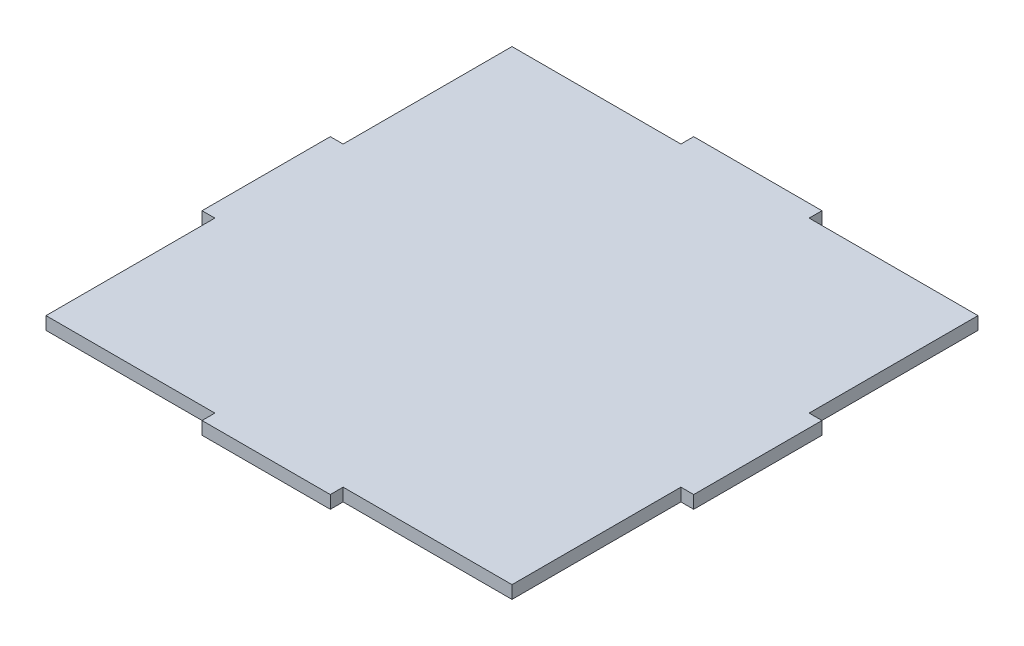
ISO-10303-21;
HEADER;
FILE_DESCRIPTION(('STEP AP214'),'2;1');
FILE_NAME('part.step','',(''),(''),'','','');
FILE_SCHEMA(('AUTOMOTIVE_DESIGN { 1 0 10303 214 1 1 1 1 }'));
ENDSEC;
DATA;
#1=APPLICATION_CONTEXT('core data for automotive mechanical design processes');
#2=APPLICATION_PROTOCOL_DEFINITION('international standard','automotive_design',2000,#1);
#3=PRODUCT_CONTEXT('',#1,'mechanical');
#4=PRODUCT('Part','Part','',(#3));
#5=PRODUCT_RELATED_PRODUCT_CATEGORY('part','',(#4));
#6=PRODUCT_DEFINITION_FORMATION('','',#4);
#7=PRODUCT_DEFINITION_CONTEXT('part definition',#1,'design');
#8=PRODUCT_DEFINITION('design','',#6,#7);
#9=PRODUCT_DEFINITION_SHAPE('','',#8);
#10=(LENGTH_UNIT() NAMED_UNIT(*) SI_UNIT(.MILLI.,.METRE.));
#11=(NAMED_UNIT(*) PLANE_ANGLE_UNIT() SI_UNIT($,.RADIAN.));
#12=(NAMED_UNIT(*) SI_UNIT($,.STERADIAN.) SOLID_ANGLE_UNIT());
#13=UNCERTAINTY_MEASURE_WITH_UNIT(LENGTH_MEASURE(1.E-05),#10,'distance_accuracy_value','');
#14=(GEOMETRIC_REPRESENTATION_CONTEXT(3) GLOBAL_UNCERTAINTY_ASSIGNED_CONTEXT((#13)) GLOBAL_UNIT_ASSIGNED_CONTEXT((#10,
#11,#12)) REPRESENTATION_CONTEXT('',''));
#15=CARTESIAN_POINT('',(0.,0.,0.));
#16=DIRECTION('',(0.,0.,1.));
#17=DIRECTION('',(1.,0.,0.));
#18=AXIS2_PLACEMENT_3D('',#15,#16,#17);
#19=CARTESIAN_POINT('',(14.9999999999994,3.,-1.73472347597673E-13));
#20=DIRECTION('',(1.,0.,0.));
#21=DIRECTION('',(0.,0.,-1.));
#22=AXIS2_PLACEMENT_3D('',#19,#20,#21);
#23=PLANE('',#22);
#24=DIRECTION('',(0.,0.,1.));
#25=VECTOR('',#24,1.);
#26=CARTESIAN_POINT('',(14.9999999999994,0.,-1.73472347597673E-13));
#27=LINE('',#26,#25);
#28=CARTESIAN_POINT('',(15.,0.,54.5));
#29=VERTEX_POINT('',#28);
#30=CARTESIAN_POINT('',(15.,0.,57.5));
#31=VERTEX_POINT('',#30);
#32=EDGE_CURVE('E207',#29,#31,#27,.T.);
#33=ORIENTED_EDGE('',*,*,#32,.F.);
#34=DIRECTION('',(0.,-1.,0.));
#35=VECTOR('',#34,1.);
#36=CARTESIAN_POINT('',(15.,3.,54.5));
#37=LINE('',#36,#35);
#38=CARTESIAN_POINT('',(15.,3.,54.5));
#39=VERTEX_POINT('',#38);
#40=EDGE_CURVE('E11',#39,#29,#37,.T.);
#41=ORIENTED_EDGE('',*,*,#40,.F.);
#42=DIRECTION('',(0.,0.,1.));
#43=VECTOR('',#42,1.);
#44=CARTESIAN_POINT('',(14.9999999999994,3.,-1.73472347597673E-13));
#45=LINE('',#44,#43);
#46=CARTESIAN_POINT('',(15.,3.,57.5));
#47=VERTEX_POINT('',#46);
#48=EDGE_CURVE('E254',#39,#47,#45,.T.);
#49=ORIENTED_EDGE('',*,*,#48,.T.);
#50=DIRECTION('',(0.,-1.,0.));
#51=VECTOR('',#50,1.);
#52=CARTESIAN_POINT('',(15.,3.,57.5));
#53=LINE('',#52,#51);
#54=EDGE_CURVE('E55',#47,#31,#53,.T.);
#55=ORIENTED_EDGE('',*,*,#54,.T.);
#56=EDGE_LOOP('',(#33,#41,#49,#55));
#57=FACE_BOUND('',#56,.T.);
#58=ADVANCED_FACE('F39',(#57),#23,.T.);
#59=CARTESIAN_POINT('',(0.,3.,54.5));
#60=DIRECTION('',(0.,0.,1.));
#61=DIRECTION('',(1.,0.,0.));
#62=AXIS2_PLACEMENT_3D('',#59,#60,#61);
#63=PLANE('',#62);
#64=DIRECTION('',(-1.,0.,0.));
#65=VECTOR('',#64,1.);
#66=CARTESIAN_POINT('',(0.,0.,54.5));
#67=LINE('',#66,#65);
#68=CARTESIAN_POINT('',(54.5,0.,54.5));
#69=VERTEX_POINT('',#68);
#70=EDGE_CURVE('E209',#69,#29,#67,.T.);
#71=ORIENTED_EDGE('',*,*,#70,.F.);
#72=DIRECTION('',(0.,-1.,0.));
#73=VECTOR('',#72,1.);
#74=CARTESIAN_POINT('',(54.5,3.,54.5));
#75=LINE('',#74,#73);
#76=CARTESIAN_POINT('',(54.5,3.,54.5));
#77=VERTEX_POINT('',#76);
#78=EDGE_CURVE('E47',#77,#69,#75,.T.);
#79=ORIENTED_EDGE('',*,*,#78,.F.);
#80=DIRECTION('',(-1.,0.,0.));
#81=VECTOR('',#80,1.);
#82=CARTESIAN_POINT('',(0.,3.,54.5));
#83=LINE('',#82,#81);
#84=EDGE_CURVE('E198',#77,#39,#83,.T.);
#85=ORIENTED_EDGE('',*,*,#84,.T.);
#86=ORIENTED_EDGE('',*,*,#40,.T.);
#87=EDGE_LOOP('',(#71,#79,#85,#86));
#88=FACE_BOUND('',#87,.T.);
#89=ADVANCED_FACE('F297',(#88),#63,.T.);
#90=CARTESIAN_POINT('',(54.5,3.,0.));
#91=DIRECTION('',(1.,0.,0.));
#92=DIRECTION('',(0.,0.,-1.));
#93=AXIS2_PLACEMENT_3D('',#90,#91,#92);
#94=PLANE('',#93);
#95=DIRECTION('',(0.,0.,1.));
#96=VECTOR('',#95,1.);
#97=CARTESIAN_POINT('',(54.5,0.,0.));
#98=LINE('',#97,#96);
#99=CARTESIAN_POINT('',(54.5,0.,15.));
#100=VERTEX_POINT('',#99);
#101=EDGE_CURVE('E212',#100,#69,#98,.T.);
#102=ORIENTED_EDGE('',*,*,#101,.F.);
#103=DIRECTION('',(0.,-1.,0.));
#104=VECTOR('',#103,1.);
#105=CARTESIAN_POINT('',(54.5,3.,15.));
#106=LINE('',#105,#104);
#107=CARTESIAN_POINT('',(54.5,3.,15.));
#108=VERTEX_POINT('',#107);
#109=EDGE_CURVE('E286',#108,#100,#106,.T.);
#110=ORIENTED_EDGE('',*,*,#109,.F.);
#111=DIRECTION('',(0.,0.,1.));
#112=VECTOR('',#111,1.);
#113=CARTESIAN_POINT('',(54.5,3.,0.));
#114=LINE('',#113,#112);
#115=EDGE_CURVE('E293',#108,#77,#114,.T.);
#116=ORIENTED_EDGE('',*,*,#115,.T.);
#117=ORIENTED_EDGE('',*,*,#78,.T.);
#118=EDGE_LOOP('',(#102,#110,#116,#117));
#119=FACE_BOUND('',#118,.T.);
#120=ADVANCED_FACE('F291',(#119),#94,.T.);
#121=CARTESIAN_POINT('',(0.,3.,15.));
#122=DIRECTION('',(0.,0.,-1.));
#123=DIRECTION('',(-1.,0.,0.));
#124=AXIS2_PLACEMENT_3D('',#121,#122,#123);
#125=PLANE('',#124);
#126=DIRECTION('',(1.,0.,0.));
#127=VECTOR('',#126,1.);
#128=CARTESIAN_POINT('',(0.,0.,15.));
#129=LINE('',#128,#127);
#130=CARTESIAN_POINT('',(57.5,0.,15.));
#131=VERTEX_POINT('',#130);
#132=EDGE_CURVE('E215',#100,#131,#129,.T.);
#133=ORIENTED_EDGE('',*,*,#132,.T.);
#134=DIRECTION('',(0.,-1.,0.));
#135=VECTOR('',#134,1.);
#136=CARTESIAN_POINT('',(57.5,3.,15.));
#137=LINE('',#136,#135);
#138=CARTESIAN_POINT('',(57.5,3.,15.));
#139=VERTEX_POINT('',#138);
#140=EDGE_CURVE('E284',#139,#131,#137,.T.);
#141=ORIENTED_EDGE('',*,*,#140,.F.);
#142=DIRECTION('',(1.,0.,0.));
#143=VECTOR('',#142,1.);
#144=CARTESIAN_POINT('',(0.,3.,15.));
#145=LINE('',#144,#143);
#146=EDGE_CURVE('E308',#108,#139,#145,.T.);
#147=ORIENTED_EDGE('',*,*,#146,.F.);
#148=ORIENTED_EDGE('',*,*,#109,.T.);
#149=EDGE_LOOP('',(#133,#141,#147,#148));
#150=FACE_BOUND('',#149,.T.);
#151=ADVANCED_FACE('F305',(#150),#125,.F.);
#152=CARTESIAN_POINT('',(57.5,3.,0.));
#153=DIRECTION('',(1.,0.,0.));
#154=DIRECTION('',(0.,0.,-1.));
#155=AXIS2_PLACEMENT_3D('',#152,#153,#154);
#156=PLANE('',#155);
#157=DIRECTION('',(0.,0.,1.));
#158=VECTOR('',#157,1.);
#159=CARTESIAN_POINT('',(57.5,0.,0.));
#160=LINE('',#159,#158);
#161=CARTESIAN_POINT('',(57.5,0.,-15.));
#162=VERTEX_POINT('',#161);
#163=EDGE_CURVE('E219',#162,#131,#160,.T.);
#164=ORIENTED_EDGE('',*,*,#163,.F.);
#165=DIRECTION('',(0.,-1.,0.));
#166=VECTOR('',#165,1.);
#167=CARTESIAN_POINT('',(57.5,3.,-15.));
#168=LINE('',#167,#166);
#169=CARTESIAN_POINT('',(57.5,3.,-15.));
#170=VERTEX_POINT('',#169);
#171=EDGE_CURVE('E282',#170,#162,#168,.T.);
#172=ORIENTED_EDGE('',*,*,#171,.F.);
#173=DIRECTION('',(0.,0.,1.));
#174=VECTOR('',#173,1.);
#175=CARTESIAN_POINT('',(57.5,3.,0.));
#176=LINE('',#175,#174);
#177=EDGE_CURVE('E310',#170,#139,#176,.T.);
#178=ORIENTED_EDGE('',*,*,#177,.T.);
#179=ORIENTED_EDGE('',*,*,#140,.T.);
#180=EDGE_LOOP('',(#164,#172,#178,#179));
#181=FACE_BOUND('',#180,.T.);
#182=ADVANCED_FACE('F424',(#181),#156,.T.);
#183=CARTESIAN_POINT('',(0.,3.,-15.));
#184=DIRECTION('',(0.,0.,1.));
#185=DIRECTION('',(1.,0.,0.));
#186=AXIS2_PLACEMENT_3D('',#183,#184,#185);
#187=PLANE('',#186);
#188=DIRECTION('',(-1.,0.,0.));
#189=VECTOR('',#188,1.);
#190=CARTESIAN_POINT('',(0.,0.,-15.));
#191=LINE('',#190,#189);
#192=CARTESIAN_POINT('',(54.5,0.,-15.));
#193=VERTEX_POINT('',#192);
#194=EDGE_CURVE('E222',#162,#193,#191,.T.);
#195=ORIENTED_EDGE('',*,*,#194,.T.);
#196=DIRECTION('',(0.,-1.,0.));
#197=VECTOR('',#196,1.);
#198=CARTESIAN_POINT('',(54.5,3.,-15.));
#199=LINE('',#198,#197);
#200=CARTESIAN_POINT('',(54.5,3.,-15.));
#201=VERTEX_POINT('',#200);
#202=EDGE_CURVE('E280',#201,#193,#199,.T.);
#203=ORIENTED_EDGE('',*,*,#202,.F.);
#204=DIRECTION('',(-1.,0.,0.));
#205=VECTOR('',#204,1.);
#206=CARTESIAN_POINT('',(0.,3.,-15.));
#207=LINE('',#206,#205);
#208=EDGE_CURVE('E316',#170,#201,#207,.T.);
#209=ORIENTED_EDGE('',*,*,#208,.F.);
#210=ORIENTED_EDGE('',*,*,#171,.T.);
#211=EDGE_LOOP('',(#195,#203,#209,#210));
#212=FACE_BOUND('',#211,.T.);
#213=ADVANCED_FACE('F425',(#212),#187,.F.);
#214=CARTESIAN_POINT('',(54.5,0.,-54.5));
#215=VERTEX_POINT('',#214);
#216=EDGE_CURVE('E216',#215,#193,#98,.T.);
#217=ORIENTED_EDGE('',*,*,#216,.F.);
#218=DIRECTION('',(0.,-1.,0.));
#219=VECTOR('',#218,1.);
#220=CARTESIAN_POINT('',(54.5,3.,-54.5));
#221=LINE('',#220,#219);
#222=CARTESIAN_POINT('',(54.5,3.,-54.5));
#223=VERTEX_POINT('',#222);
#224=EDGE_CURVE('E278',#223,#215,#221,.T.);
#225=ORIENTED_EDGE('',*,*,#224,.F.);
#226=EDGE_CURVE('E313',#223,#201,#114,.T.);
#227=ORIENTED_EDGE('',*,*,#226,.T.);
#228=ORIENTED_EDGE('',*,*,#202,.T.);
#229=EDGE_LOOP('',(#217,#225,#227,#228));
#230=FACE_BOUND('',#229,.T.);
#231=ADVANCED_FACE('F368',(#230),#94,.T.);
#232=CARTESIAN_POINT('',(0.,3.,-54.5));
#233=DIRECTION('',(0.,0.,-1.));
#234=DIRECTION('',(-1.,0.,0.));
#235=AXIS2_PLACEMENT_3D('',#232,#233,#234);
#236=PLANE('',#235);
#237=DIRECTION('',(1.,0.,0.));
#238=VECTOR('',#237,1.);
#239=CARTESIAN_POINT('',(0.,0.,-54.5));
#240=LINE('',#239,#238);
#241=CARTESIAN_POINT('',(15.,0.,-54.5));
#242=VERTEX_POINT('',#241);
#243=EDGE_CURVE('E225',#242,#215,#240,.T.);
#244=ORIENTED_EDGE('',*,*,#243,.F.);
#245=DIRECTION('',(0.,-1.,0.));
#246=VECTOR('',#245,1.);
#247=CARTESIAN_POINT('',(15.,3.,-54.5));
#248=LINE('',#247,#246);
#249=CARTESIAN_POINT('',(15.,3.,-54.5));
#250=VERTEX_POINT('',#249);
#251=EDGE_CURVE('E276',#250,#242,#248,.T.);
#252=ORIENTED_EDGE('',*,*,#251,.F.);
#253=DIRECTION('',(1.,0.,0.));
#254=VECTOR('',#253,1.);
#255=CARTESIAN_POINT('',(0.,3.,-54.5));
#256=LINE('',#255,#254);
#257=EDGE_CURVE('E315',#250,#223,#256,.T.);
#258=ORIENTED_EDGE('',*,*,#257,.T.);
#259=ORIENTED_EDGE('',*,*,#224,.T.);
#260=EDGE_LOOP('',(#244,#252,#258,#259));
#261=FACE_BOUND('',#260,.T.);
#262=ADVANCED_FACE('F394',(#261),#236,.T.);
#263=CARTESIAN_POINT('',(14.9999999999994,3.,1.73472347597673E-13));
#264=DIRECTION('',(-1.,0.,0.));
#265=DIRECTION('',(0.,0.,1.));
#266=AXIS2_PLACEMENT_3D('',#263,#264,#265);
#267=PLANE('',#266);
#268=DIRECTION('',(0.,0.,-1.));
#269=VECTOR('',#268,1.);
#270=CARTESIAN_POINT('',(14.9999999999994,0.,1.73472347597673E-13));
#271=LINE('',#270,#269);
#272=CARTESIAN_POINT('',(15.,0.,-57.5));
#273=VERTEX_POINT('',#272);
#274=EDGE_CURVE('E228',#242,#273,#271,.T.);
#275=ORIENTED_EDGE('',*,*,#274,.T.);
#276=DIRECTION('',(0.,-1.,0.));
#277=VECTOR('',#276,1.);
#278=CARTESIAN_POINT('',(15.,3.,-57.5));
#279=LINE('',#278,#277);
#280=CARTESIAN_POINT('',(15.,3.,-57.5));
#281=VERTEX_POINT('',#280);
#282=EDGE_CURVE('E273',#281,#273,#279,.T.);
#283=ORIENTED_EDGE('',*,*,#282,.F.);
#284=DIRECTION('',(0.,0.,-1.));
#285=VECTOR('',#284,1.);
#286=CARTESIAN_POINT('',(14.9999999999994,3.,1.73472347597673E-13));
#287=LINE('',#286,#285);
#288=EDGE_CURVE('E320',#250,#281,#287,.T.);
#289=ORIENTED_EDGE('',*,*,#288,.F.);
#290=ORIENTED_EDGE('',*,*,#251,.T.);
#291=EDGE_LOOP('',(#275,#283,#289,#290));
#292=FACE_BOUND('',#291,.T.);
#293=ADVANCED_FACE('F416',(#292),#267,.F.);
#294=CARTESIAN_POINT('',(0.,3.,-57.5));
#295=DIRECTION('',(0.,0.,1.));
#296=DIRECTION('',(1.,0.,0.));
#297=AXIS2_PLACEMENT_3D('',#294,#295,#296);
#298=PLANE('',#297);
#299=DIRECTION('',(-1.,0.,0.));
#300=VECTOR('',#299,1.);
#301=CARTESIAN_POINT('',(0.,0.,-57.5));
#302=LINE('',#301,#300);
#303=CARTESIAN_POINT('',(-15.,0.,-57.5));
#304=VERTEX_POINT('',#303);
#305=EDGE_CURVE('E231',#273,#304,#302,.T.);
#306=ORIENTED_EDGE('',*,*,#305,.T.);
#307=DIRECTION('',(0.,-1.,0.));
#308=VECTOR('',#307,1.);
#309=CARTESIAN_POINT('',(-15.,3.,-57.5));
#310=LINE('',#309,#308);
#311=CARTESIAN_POINT('',(-15.,3.,-57.5));
#312=VERTEX_POINT('',#311);
#313=EDGE_CURVE('E270',#312,#304,#310,.T.);
#314=ORIENTED_EDGE('',*,*,#313,.F.);
#315=DIRECTION('',(-1.,0.,0.));
#316=VECTOR('',#315,1.);
#317=CARTESIAN_POINT('',(0.,3.,-57.5));
#318=LINE('',#317,#316);
#319=EDGE_CURVE('E329',#281,#312,#318,.T.);
#320=ORIENTED_EDGE('',*,*,#319,.F.);
#321=ORIENTED_EDGE('',*,*,#282,.T.);
#322=EDGE_LOOP('',(#306,#314,#320,#321));
#323=FACE_BOUND('',#322,.T.);
#324=ADVANCED_FACE('F412',(#323),#298,.F.);
#325=CARTESIAN_POINT('',(-14.9999999999996,3.,1.04083408558606E-13));
#326=DIRECTION('',(1.,0.,0.));
#327=DIRECTION('',(0.,0.,-1.));
#328=AXIS2_PLACEMENT_3D('',#325,#326,#327);
#329=PLANE('',#328);
#330=DIRECTION('',(0.,0.,1.));
#331=VECTOR('',#330,1.);
#332=CARTESIAN_POINT('',(-14.9999999999996,0.,1.04083408558606E-13));
#333=LINE('',#332,#331);
#334=CARTESIAN_POINT('',(-15.,0.,-54.5));
#335=VERTEX_POINT('',#334);
#336=EDGE_CURVE('E233',#304,#335,#333,.T.);
#337=ORIENTED_EDGE('',*,*,#336,.T.);
#338=DIRECTION('',(0.,-1.,0.));
#339=VECTOR('',#338,1.);
#340=CARTESIAN_POINT('',(-15.,3.,-54.5));
#341=LINE('',#340,#339);
#342=CARTESIAN_POINT('',(-15.,3.,-54.5));
#343=VERTEX_POINT('',#342);
#344=EDGE_CURVE('E268',#343,#335,#341,.T.);
#345=ORIENTED_EDGE('',*,*,#344,.F.);
#346=DIRECTION('',(0.,0.,1.));
#347=VECTOR('',#346,1.);
#348=CARTESIAN_POINT('',(-14.9999999999996,3.,1.04083408558606E-13));
#349=LINE('',#348,#347);
#350=EDGE_CURVE('E331',#312,#343,#349,.T.);
#351=ORIENTED_EDGE('',*,*,#350,.F.);
#352=ORIENTED_EDGE('',*,*,#313,.T.);
#353=EDGE_LOOP('',(#337,#345,#351,#352));
#354=FACE_BOUND('',#353,.T.);
#355=ADVANCED_FACE('F391',(#354),#329,.F.);
#356=CARTESIAN_POINT('',(-54.5,0.,-54.5));
#357=VERTEX_POINT('',#356);
#358=EDGE_CURVE('E229',#357,#335,#240,.T.);
#359=ORIENTED_EDGE('',*,*,#358,.F.);
#360=DIRECTION('',(0.,-1.,0.));
#361=VECTOR('',#360,1.);
#362=CARTESIAN_POINT('',(-54.5,3.,-54.5));
#363=LINE('',#362,#361);
#364=CARTESIAN_POINT('',(-54.5,3.,-54.5));
#365=VERTEX_POINT('',#364);
#366=EDGE_CURVE('E266',#365,#357,#363,.T.);
#367=ORIENTED_EDGE('',*,*,#366,.F.);
#368=EDGE_CURVE('E322',#365,#343,#256,.T.);
#369=ORIENTED_EDGE('',*,*,#368,.T.);
#370=ORIENTED_EDGE('',*,*,#344,.T.);
#371=EDGE_LOOP('',(#359,#367,#369,#370));
#372=FACE_BOUND('',#371,.T.);
#373=ADVANCED_FACE('F383',(#372),#236,.T.);
#374=CARTESIAN_POINT('',(-54.5,3.,0.));
#375=DIRECTION('',(-1.,0.,0.));
#376=DIRECTION('',(0.,0.,1.));
#377=AXIS2_PLACEMENT_3D('',#374,#375,#376);
#378=PLANE('',#377);
#379=DIRECTION('',(0.,0.,-1.));
#380=VECTOR('',#379,1.);
#381=CARTESIAN_POINT('',(-54.5,0.,0.));
#382=LINE('',#381,#380);
#383=CARTESIAN_POINT('',(-54.5,0.,-15.));
#384=VERTEX_POINT('',#383);
#385=EDGE_CURVE('E236',#384,#357,#382,.T.);
#386=ORIENTED_EDGE('',*,*,#385,.F.);
#387=DIRECTION('',(0.,-1.,0.));
#388=VECTOR('',#387,1.);
#389=CARTESIAN_POINT('',(-54.5,3.,-15.));
#390=LINE('',#389,#388);
#391=CARTESIAN_POINT('',(-54.5,3.,-15.));
#392=VERTEX_POINT('',#391);
#393=EDGE_CURVE('E264',#392,#384,#390,.T.);
#394=ORIENTED_EDGE('',*,*,#393,.F.);
#395=DIRECTION('',(0.,0.,-1.));
#396=VECTOR('',#395,1.);
#397=CARTESIAN_POINT('',(-54.5,3.,0.));
#398=LINE('',#397,#396);
#399=EDGE_CURVE('E333',#392,#365,#398,.T.);
#400=ORIENTED_EDGE('',*,*,#399,.T.);
#401=ORIENTED_EDGE('',*,*,#366,.T.);
#402=EDGE_LOOP('',(#386,#394,#400,#401));
#403=FACE_BOUND('',#402,.T.);
#404=ADVANCED_FACE('F375',(#403),#378,.T.);
#405=CARTESIAN_POINT('',(0.,3.,-15.));
#406=DIRECTION('',(0.,0.,-1.));
#407=DIRECTION('',(-1.,0.,0.));
#408=AXIS2_PLACEMENT_3D('',#405,#406,#407);
#409=PLANE('',#408);
#410=DIRECTION('',(1.,0.,0.));
#411=VECTOR('',#410,1.);
#412=CARTESIAN_POINT('',(0.,0.,-15.));
#413=LINE('',#412,#411);
#414=CARTESIAN_POINT('',(-57.5,0.,-15.));
#415=VERTEX_POINT('',#414);
#416=EDGE_CURVE('E239',#415,#384,#413,.T.);
#417=ORIENTED_EDGE('',*,*,#416,.F.);
#418=DIRECTION('',(0.,-1.,0.));
#419=VECTOR('',#418,1.);
#420=CARTESIAN_POINT('',(-57.5,3.,-15.));
#421=LINE('',#420,#419);
#422=CARTESIAN_POINT('',(-57.5,3.,-15.));
#423=VERTEX_POINT('',#422);
#424=EDGE_CURVE('E262',#423,#415,#421,.T.);
#425=ORIENTED_EDGE('',*,*,#424,.F.);
#426=DIRECTION('',(1.,0.,0.));
#427=VECTOR('',#426,1.);
#428=CARTESIAN_POINT('',(0.,3.,-15.));
#429=LINE('',#428,#427);
#430=EDGE_CURVE('E336',#423,#392,#429,.T.);
#431=ORIENTED_EDGE('',*,*,#430,.T.);
#432=ORIENTED_EDGE('',*,*,#393,.T.);
#433=EDGE_LOOP('',(#417,#425,#431,#432));
#434=FACE_BOUND('',#433,.T.);
#435=ADVANCED_FACE('F382',(#434),#409,.T.);
#436=CARTESIAN_POINT('',(-57.5,3.,0.));
#437=DIRECTION('',(1.,0.,0.));
#438=DIRECTION('',(0.,0.,-1.));
#439=AXIS2_PLACEMENT_3D('',#436,#437,#438);
#440=PLANE('',#439);
#441=DIRECTION('',(0.,0.,1.));
#442=VECTOR('',#441,1.);
#443=CARTESIAN_POINT('',(-57.5,0.,0.));
#444=LINE('',#443,#442);
#445=CARTESIAN_POINT('',(-57.5,0.,15.));
#446=VERTEX_POINT('',#445);
#447=EDGE_CURVE('E243',#415,#446,#444,.T.);
#448=ORIENTED_EDGE('',*,*,#447,.T.);
#449=DIRECTION('',(0.,-1.,0.));
#450=VECTOR('',#449,1.);
#451=CARTESIAN_POINT('',(-57.5,3.,15.));
#452=LINE('',#451,#450);
#453=CARTESIAN_POINT('',(-57.5,3.,15.));
#454=VERTEX_POINT('',#453);
#455=EDGE_CURVE('E260',#454,#446,#452,.T.);
#456=ORIENTED_EDGE('',*,*,#455,.F.);
#457=DIRECTION('',(0.,0.,1.));
#458=VECTOR('',#457,1.);
#459=CARTESIAN_POINT('',(-57.5,3.,0.));
#460=LINE('',#459,#458);
#461=EDGE_CURVE('E338',#423,#454,#460,.T.);
#462=ORIENTED_EDGE('',*,*,#461,.F.);
#463=ORIENTED_EDGE('',*,*,#424,.T.);
#464=EDGE_LOOP('',(#448,#456,#462,#463));
#465=FACE_BOUND('',#464,.T.);
#466=ADVANCED_FACE('F379',(#465),#440,.F.);
#467=CARTESIAN_POINT('',(1.38777878078138E-13,3.,14.9999999999995));
#468=DIRECTION('',(0.,0.,1.));
#469=DIRECTION('',(1.,0.,0.));
#470=AXIS2_PLACEMENT_3D('',#467,#468,#469);
#471=PLANE('',#470);
#472=DIRECTION('',(-1.,0.,0.));
#473=VECTOR('',#472,1.);
#474=CARTESIAN_POINT('',(1.38777878078138E-13,0.,14.9999999999995));
#475=LINE('',#474,#473);
#476=CARTESIAN_POINT('',(-54.5,0.,15.));
#477=VERTEX_POINT('',#476);
#478=EDGE_CURVE('E246',#477,#446,#475,.T.);
#479=ORIENTED_EDGE('',*,*,#478,.F.);
#480=DIRECTION('',(0.,-1.,0.));
#481=VECTOR('',#480,1.);
#482=CARTESIAN_POINT('',(-54.5,3.,15.));
#483=LINE('',#482,#481);
#484=CARTESIAN_POINT('',(-54.5,3.,15.));
#485=VERTEX_POINT('',#484);
#486=EDGE_CURVE('E258',#485,#477,#483,.T.);
#487=ORIENTED_EDGE('',*,*,#486,.F.);
#488=DIRECTION('',(-1.,0.,0.));
#489=VECTOR('',#488,1.);
#490=CARTESIAN_POINT('',(1.38777878078138E-13,3.,14.9999999999995));
#491=LINE('',#490,#489);
#492=EDGE_CURVE('E204',#485,#454,#491,.T.);
#493=ORIENTED_EDGE('',*,*,#492,.T.);
#494=ORIENTED_EDGE('',*,*,#455,.T.);
#495=EDGE_LOOP('',(#479,#487,#493,#494));
#496=FACE_BOUND('',#495,.T.);
#497=ADVANCED_FACE('F374',(#496),#471,.T.);
#498=CARTESIAN_POINT('',(-54.5,0.,54.5));
#499=VERTEX_POINT('',#498);
#500=EDGE_CURVE('E240',#499,#477,#382,.T.);
#501=ORIENTED_EDGE('',*,*,#500,.F.);
#502=DIRECTION('',(0.,-1.,0.));
#503=VECTOR('',#502,1.);
#504=CARTESIAN_POINT('',(-54.5,3.,54.5));
#505=LINE('',#504,#503);
#506=CARTESIAN_POINT('',(-54.5,3.,54.5));
#507=VERTEX_POINT('',#506);
#508=EDGE_CURVE('E186',#507,#499,#505,.T.);
#509=ORIENTED_EDGE('',*,*,#508,.F.);
#510=EDGE_CURVE('E196',#507,#485,#398,.T.);
#511=ORIENTED_EDGE('',*,*,#510,.T.);
#512=ORIENTED_EDGE('',*,*,#486,.T.);
#513=EDGE_LOOP('',(#501,#509,#511,#512));
#514=FACE_BOUND('',#513,.T.);
#515=ADVANCED_FACE('F346',(#514),#378,.T.);
#516=CARTESIAN_POINT('',(-15.,0.,54.5));
#517=VERTEX_POINT('',#516);
#518=EDGE_CURVE('E182',#517,#499,#67,.T.);
#519=ORIENTED_EDGE('',*,*,#518,.F.);
#520=DIRECTION('',(0.,-1.,0.));
#521=VECTOR('',#520,1.);
#522=CARTESIAN_POINT('',(-15.,3.,54.5));
#523=LINE('',#522,#521);
#524=CARTESIAN_POINT('',(-15.,3.,54.5));
#525=VERTEX_POINT('',#524);
#526=EDGE_CURVE('E177',#525,#517,#523,.T.);
#527=ORIENTED_EDGE('',*,*,#526,.F.);
#528=EDGE_CURVE('E180',#525,#507,#83,.T.);
#529=ORIENTED_EDGE('',*,*,#528,.T.);
#530=ORIENTED_EDGE('',*,*,#508,.T.);
#531=EDGE_LOOP('',(#519,#527,#529,#530));
#532=FACE_BOUND('',#531,.T.);
#533=ADVANCED_FACE('F179',(#532),#63,.T.);
#534=CARTESIAN_POINT('',(-14.9999999999988,3.,-3.12250225675802E-13));
#535=DIRECTION('',(-1.,0.,0.));
#536=DIRECTION('',(0.,0.,1.));
#537=AXIS2_PLACEMENT_3D('',#534,#535,#536);
#538=PLANE('',#537);
#539=DIRECTION('',(0.,0.,-1.));
#540=VECTOR('',#539,1.);
#541=CARTESIAN_POINT('',(-14.9999999999988,0.,-3.12250225675802E-13));
#542=LINE('',#541,#540);
#543=CARTESIAN_POINT('',(-15.,0.,57.5));
#544=VERTEX_POINT('',#543);
#545=EDGE_CURVE('E249',#544,#517,#542,.T.);
#546=ORIENTED_EDGE('',*,*,#545,.F.);
#547=DIRECTION('',(0.,-1.,0.));
#548=VECTOR('',#547,1.);
#549=CARTESIAN_POINT('',(-15.,3.,57.5));
#550=LINE('',#549,#548);
#551=CARTESIAN_POINT('',(-15.,3.,57.5));
#552=VERTEX_POINT('',#551);
#553=EDGE_CURVE('E116',#552,#544,#550,.T.);
#554=ORIENTED_EDGE('',*,*,#553,.F.);
#555=DIRECTION('',(0.,0.,-1.));
#556=VECTOR('',#555,1.);
#557=CARTESIAN_POINT('',(-14.9999999999988,3.,-3.12250225675802E-13));
#558=LINE('',#557,#556);
#559=EDGE_CURVE('E193',#552,#525,#558,.T.);
#560=ORIENTED_EDGE('',*,*,#559,.T.);
#561=ORIENTED_EDGE('',*,*,#526,.T.);
#562=EDGE_LOOP('',(#546,#554,#560,#561));
#563=FACE_BOUND('',#562,.T.);
#564=ADVANCED_FACE('F199',(#563),#538,.T.);
#565=CARTESIAN_POINT('',(0.,3.,57.5));
#566=DIRECTION('',(0.,0.,1.));
#567=DIRECTION('',(1.,0.,0.));
#568=AXIS2_PLACEMENT_3D('',#565,#566,#567);
#569=PLANE('',#568);
#570=DIRECTION('',(-1.,0.,0.));
#571=VECTOR('',#570,1.);
#572=CARTESIAN_POINT('',(0.,0.,57.5));
#573=LINE('',#572,#571);
#574=EDGE_CURVE('E251',#31,#544,#573,.T.);
#575=ORIENTED_EDGE('',*,*,#574,.F.);
#576=ORIENTED_EDGE('',*,*,#54,.F.);
#577=DIRECTION('',(-1.,0.,0.));
#578=VECTOR('',#577,1.);
#579=CARTESIAN_POINT('',(0.,3.,57.5));
#580=LINE('',#579,#578);
#581=EDGE_CURVE('E200',#47,#552,#580,.T.);
#582=ORIENTED_EDGE('',*,*,#581,.T.);
#583=ORIENTED_EDGE('',*,*,#553,.T.);
#584=EDGE_LOOP('',(#575,#576,#582,#583));
#585=FACE_BOUND('',#584,.T.);
#586=ADVANCED_FACE('F349',(#585),#569,.T.);
#587=CARTESIAN_POINT('',(0.,3.,0.));
#588=DIRECTION('',(0.,1.,0.));
#589=DIRECTION('',(0.,0.,1.));
#590=AXIS2_PLACEMENT_3D('',#587,#588,#589);
#591=PLANE('',#590);
#592=ORIENTED_EDGE('',*,*,#48,.F.);
#593=ORIENTED_EDGE('',*,*,#84,.F.);
#594=ORIENTED_EDGE('',*,*,#115,.F.);
#595=ORIENTED_EDGE('',*,*,#146,.T.);
#596=ORIENTED_EDGE('',*,*,#177,.F.);
#597=ORIENTED_EDGE('',*,*,#208,.T.);
#598=ORIENTED_EDGE('',*,*,#226,.F.);
#599=ORIENTED_EDGE('',*,*,#257,.F.);
#600=ORIENTED_EDGE('',*,*,#288,.T.);
#601=ORIENTED_EDGE('',*,*,#319,.T.);
#602=ORIENTED_EDGE('',*,*,#350,.T.);
#603=ORIENTED_EDGE('',*,*,#368,.F.);
#604=ORIENTED_EDGE('',*,*,#399,.F.);
#605=ORIENTED_EDGE('',*,*,#430,.F.);
#606=ORIENTED_EDGE('',*,*,#461,.T.);
#607=ORIENTED_EDGE('',*,*,#492,.F.);
#608=ORIENTED_EDGE('',*,*,#510,.F.);
#609=ORIENTED_EDGE('',*,*,#528,.F.);
#610=ORIENTED_EDGE('',*,*,#559,.F.);
#611=ORIENTED_EDGE('',*,*,#581,.F.);
#612=EDGE_LOOP('',(#592,#593,#594,#595,#596,#597,#598,#599,#600,#601,#602,#603,#604,#605,#606,
#607,#608,#609,#610,#611));
#613=FACE_BOUND('',#612,.T.);
#614=ADVANCED_FACE('F191',(#613),#591,.T.);
#615=CARTESIAN_POINT('',(0.,0.,0.));
#616=DIRECTION('',(0.,1.,0.));
#617=DIRECTION('',(0.,0.,1.));
#618=AXIS2_PLACEMENT_3D('',#615,#616,#617);
#619=PLANE('',#618);
#620=ORIENTED_EDGE('',*,*,#32,.T.);
#621=ORIENTED_EDGE('',*,*,#574,.T.);
#622=ORIENTED_EDGE('',*,*,#545,.T.);
#623=ORIENTED_EDGE('',*,*,#518,.T.);
#624=ORIENTED_EDGE('',*,*,#500,.T.);
#625=ORIENTED_EDGE('',*,*,#478,.T.);
#626=ORIENTED_EDGE('',*,*,#447,.F.);
#627=ORIENTED_EDGE('',*,*,#416,.T.);
#628=ORIENTED_EDGE('',*,*,#385,.T.);
#629=ORIENTED_EDGE('',*,*,#358,.T.);
#630=ORIENTED_EDGE('',*,*,#336,.F.);
#631=ORIENTED_EDGE('',*,*,#305,.F.);
#632=ORIENTED_EDGE('',*,*,#274,.F.);
#633=ORIENTED_EDGE('',*,*,#243,.T.);
#634=ORIENTED_EDGE('',*,*,#216,.T.);
#635=ORIENTED_EDGE('',*,*,#194,.F.);
#636=ORIENTED_EDGE('',*,*,#163,.T.);
#637=ORIENTED_EDGE('',*,*,#132,.F.);
#638=ORIENTED_EDGE('',*,*,#101,.T.);
#639=ORIENTED_EDGE('',*,*,#70,.T.);
#640=EDGE_LOOP('',(#620,#621,#622,#623,#624,#625,#626,#627,#628,#629,#630,#631,#632,#633,#634,
#635,#636,#637,#638,#639));
#641=FACE_BOUND('',#640,.T.);
#642=ADVANCED_FACE('F300',(#641),#619,.F.);
#643=CLOSED_SHELL('',(#58,#89,#120,#151,#182,#213,#231,#262,#293,#324,#355,#373,#404,#435,#466,
#497,#515,#533,#564,#586,#614,#642));
#644=MANIFOLD_SOLID_BREP('B2',#643);
#645=ADVANCED_BREP_SHAPE_REPRESENTATION('',(#18,#644),#14);
#646=SHAPE_DEFINITION_REPRESENTATION(#9,#645);
ENDSEC;
END-ISO-10303-21;
